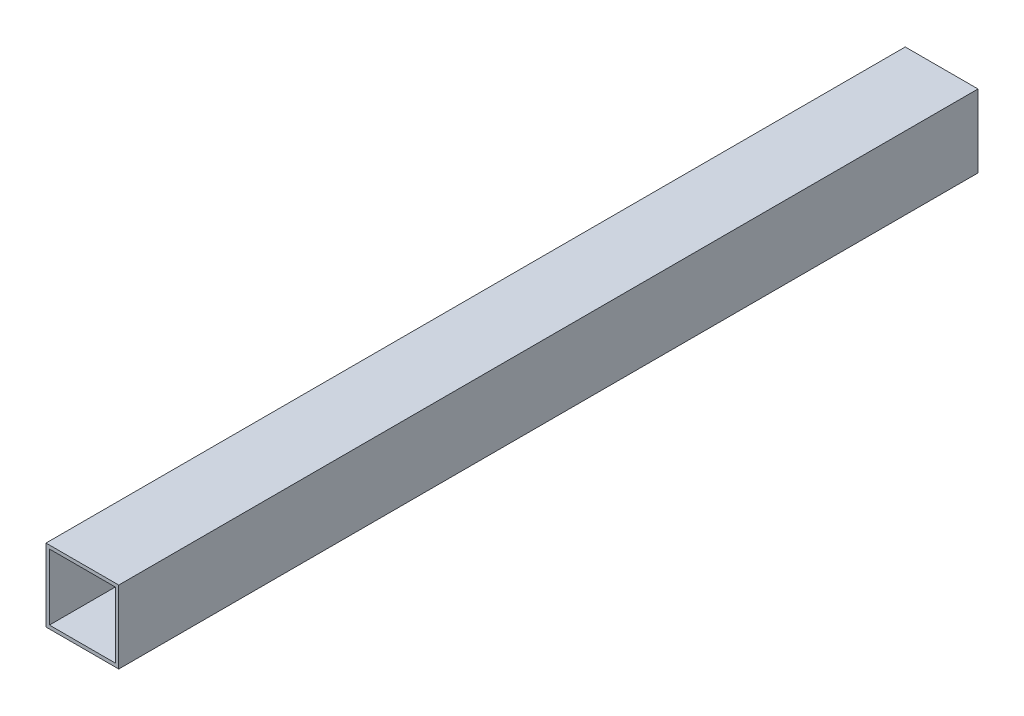
ISO-10303-21;
HEADER;
FILE_DESCRIPTION(('STEP AP214'),'2;1');
FILE_NAME('part.step','',(''),(''),'','','');
FILE_SCHEMA(('AUTOMOTIVE_DESIGN { 1 0 10303 214 1 1 1 1 }'));
ENDSEC;
DATA;
#1=APPLICATION_CONTEXT('core data for automotive mechanical design processes');
#2=APPLICATION_PROTOCOL_DEFINITION('international standard','automotive_design',2000,#1);
#3=PRODUCT_CONTEXT('',#1,'mechanical');
#4=PRODUCT('Part','Part','',(#3));
#5=PRODUCT_RELATED_PRODUCT_CATEGORY('part','',(#4));
#6=PRODUCT_DEFINITION_FORMATION('','',#4);
#7=PRODUCT_DEFINITION_CONTEXT('part definition',#1,'design');
#8=PRODUCT_DEFINITION('design','',#6,#7);
#9=PRODUCT_DEFINITION_SHAPE('','',#8);
#10=(LENGTH_UNIT() NAMED_UNIT(*) SI_UNIT(.MILLI.,.METRE.));
#11=(NAMED_UNIT(*) PLANE_ANGLE_UNIT() SI_UNIT($,.RADIAN.));
#12=(NAMED_UNIT(*) SI_UNIT($,.STERADIAN.) SOLID_ANGLE_UNIT());
#13=UNCERTAINTY_MEASURE_WITH_UNIT(LENGTH_MEASURE(1.E-05),#10,'distance_accuracy_value','');
#14=(GEOMETRIC_REPRESENTATION_CONTEXT(3) GLOBAL_UNCERTAINTY_ASSIGNED_CONTEXT((#13)) GLOBAL_UNIT_ASSIGNED_CONTEXT((#10,
#11,#12)) REPRESENTATION_CONTEXT('',''));
#15=CARTESIAN_POINT('',(0.,0.,0.));
#16=DIRECTION('',(0.,0.,1.));
#17=DIRECTION('',(1.,0.,0.));
#18=AXIS2_PLACEMENT_3D('',#15,#16,#17);
#19=CARTESIAN_POINT('',(0.,0.,150.));
#20=DIRECTION('',(0.,0.,-1.));
#21=DIRECTION('',(-1.,0.,0.));
#22=AXIS2_PLACEMENT_3D('',#19,#20,#21);
#23=PLANE('',#22);
#24=DIRECTION('',(0.,-1.,0.));
#25=VECTOR('',#24,1.);
#26=CARTESIAN_POINT('',(-12.7,12.7,150.));
#27=LINE('',#26,#25);
#28=CARTESIAN_POINT('',(-12.7,12.7,150.));
#29=VERTEX_POINT('',#28);
#30=CARTESIAN_POINT('',(-12.7,-12.7,150.));
#31=VERTEX_POINT('',#30);
#32=EDGE_CURVE('E138',#29,#31,#27,.T.);
#33=ORIENTED_EDGE('',*,*,#32,.T.);
#34=DIRECTION('',(1.,0.,0.));
#35=VECTOR('',#34,1.);
#36=CARTESIAN_POINT('',(12.7,-12.7,150.));
#37=LINE('',#36,#35);
#38=CARTESIAN_POINT('',(12.7,-12.7,150.));
#39=VERTEX_POINT('',#38);
#40=EDGE_CURVE('E141',#31,#39,#37,.T.);
#41=ORIENTED_EDGE('',*,*,#40,.T.);
#42=DIRECTION('',(0.,1.,0.));
#43=VECTOR('',#42,1.);
#44=CARTESIAN_POINT('',(12.7,12.7,150.));
#45=LINE('',#44,#43);
#46=CARTESIAN_POINT('',(12.7,12.7,150.));
#47=VERTEX_POINT('',#46);
#48=EDGE_CURVE('E144',#39,#47,#45,.T.);
#49=ORIENTED_EDGE('',*,*,#48,.T.);
#50=DIRECTION('',(-1.,0.,0.));
#51=VECTOR('',#50,1.);
#52=CARTESIAN_POINT('',(12.7,12.7,150.));
#53=LINE('',#52,#51);
#54=EDGE_CURVE('E146',#47,#29,#53,.T.);
#55=ORIENTED_EDGE('',*,*,#54,.T.);
#56=EDGE_LOOP('',(#33,#41,#49,#55));
#57=FACE_BOUND('',#56,.T.);
#58=DIRECTION('',(0.,1.,0.));
#59=VECTOR('',#58,1.);
#60=CARTESIAN_POINT('',(11.5,11.5,150.));
#61=LINE('',#60,#59);
#62=CARTESIAN_POINT('',(11.5,-11.5,150.));
#63=VERTEX_POINT('',#62);
#64=CARTESIAN_POINT('',(11.5,11.5,150.));
#65=VERTEX_POINT('',#64);
#66=EDGE_CURVE('E102',#63,#65,#61,.T.);
#67=ORIENTED_EDGE('',*,*,#66,.F.);
#68=DIRECTION('',(1.,0.,0.));
#69=VECTOR('',#68,1.);
#70=CARTESIAN_POINT('',(11.5,-11.5,150.));
#71=LINE('',#70,#69);
#72=CARTESIAN_POINT('',(-11.5,-11.5,150.));
#73=VERTEX_POINT('',#72);
#74=EDGE_CURVE('E124',#73,#63,#71,.T.);
#75=ORIENTED_EDGE('',*,*,#74,.F.);
#76=DIRECTION('',(0.,-1.,0.));
#77=VECTOR('',#76,1.);
#78=CARTESIAN_POINT('',(-11.5,11.5,150.));
#79=LINE('',#78,#77);
#80=CARTESIAN_POINT('',(-11.5,11.5,150.));
#81=VERTEX_POINT('',#80);
#82=EDGE_CURVE('E122',#81,#73,#79,.T.);
#83=ORIENTED_EDGE('',*,*,#82,.F.);
#84=DIRECTION('',(-1.,0.,0.));
#85=VECTOR('',#84,1.);
#86=CARTESIAN_POINT('',(11.5,11.5,150.));
#87=LINE('',#86,#85);
#88=EDGE_CURVE('E110',#65,#81,#87,.T.);
#89=ORIENTED_EDGE('',*,*,#88,.F.);
#90=EDGE_LOOP('',(#67,#75,#83,#89));
#91=FACE_BOUND('',#90,.T.);
#92=ADVANCED_FACE('F37',(#57,#91),#23,.F.);
#93=CARTESIAN_POINT('',(0.,0.,-150.));
#94=DIRECTION('',(0.,0.,-1.));
#95=DIRECTION('',(-1.,0.,0.));
#96=AXIS2_PLACEMENT_3D('',#93,#94,#95);
#97=PLANE('',#96);
#98=DIRECTION('',(0.,-1.,0.));
#99=VECTOR('',#98,1.);
#100=CARTESIAN_POINT('',(-12.7,12.7,-150.));
#101=LINE('',#100,#99);
#102=CARTESIAN_POINT('',(-12.7,12.7,-150.));
#103=VERTEX_POINT('',#102);
#104=CARTESIAN_POINT('',(-12.7,-12.7,-150.));
#105=VERTEX_POINT('',#104);
#106=EDGE_CURVE('E118',#103,#105,#101,.T.);
#107=ORIENTED_EDGE('',*,*,#106,.F.);
#108=DIRECTION('',(-1.,0.,0.));
#109=VECTOR('',#108,1.);
#110=CARTESIAN_POINT('',(12.7,12.7,-150.));
#111=LINE('',#110,#109);
#112=CARTESIAN_POINT('',(12.7,12.7,-150.));
#113=VERTEX_POINT('',#112);
#114=EDGE_CURVE('E142',#113,#103,#111,.T.);
#115=ORIENTED_EDGE('',*,*,#114,.F.);
#116=DIRECTION('',(0.,1.,0.));
#117=VECTOR('',#116,1.);
#118=CARTESIAN_POINT('',(12.7,12.7,-150.));
#119=LINE('',#118,#117);
#120=CARTESIAN_POINT('',(12.7,-12.7,-150.));
#121=VERTEX_POINT('',#120);
#122=EDGE_CURVE('E153',#121,#113,#119,.T.);
#123=ORIENTED_EDGE('',*,*,#122,.F.);
#124=DIRECTION('',(1.,0.,0.));
#125=VECTOR('',#124,1.);
#126=CARTESIAN_POINT('',(12.7,-12.7,-150.));
#127=LINE('',#126,#125);
#128=EDGE_CURVE('E151',#105,#121,#127,.T.);
#129=ORIENTED_EDGE('',*,*,#128,.F.);
#130=EDGE_LOOP('',(#107,#115,#123,#129));
#131=FACE_BOUND('',#130,.T.);
#132=DIRECTION('',(1.,0.,0.));
#133=VECTOR('',#132,1.);
#134=CARTESIAN_POINT('',(11.5,-11.5,-150.));
#135=LINE('',#134,#133);
#136=CARTESIAN_POINT('',(-11.5,-11.5,-150.));
#137=VERTEX_POINT('',#136);
#138=CARTESIAN_POINT('',(11.5,-11.5,-150.));
#139=VERTEX_POINT('',#138);
#140=EDGE_CURVE('E111',#137,#139,#135,.T.);
#141=ORIENTED_EDGE('',*,*,#140,.T.);
#142=DIRECTION('',(0.,1.,0.));
#143=VECTOR('',#142,1.);
#144=CARTESIAN_POINT('',(11.5,11.5,-150.));
#145=LINE('',#144,#143);
#146=CARTESIAN_POINT('',(11.5,11.5,-150.));
#147=VERTEX_POINT('',#146);
#148=EDGE_CURVE('E60',#139,#147,#145,.T.);
#149=ORIENTED_EDGE('',*,*,#148,.T.);
#150=DIRECTION('',(-1.,0.,0.));
#151=VECTOR('',#150,1.);
#152=CARTESIAN_POINT('',(11.5,11.5,-150.));
#153=LINE('',#152,#151);
#154=CARTESIAN_POINT('',(-11.5,11.5,-150.));
#155=VERTEX_POINT('',#154);
#156=EDGE_CURVE('E117',#147,#155,#153,.T.);
#157=ORIENTED_EDGE('',*,*,#156,.T.);
#158=DIRECTION('',(0.,-1.,0.));
#159=VECTOR('',#158,1.);
#160=CARTESIAN_POINT('',(-11.5,11.5,-150.));
#161=LINE('',#160,#159);
#162=EDGE_CURVE('E130',#155,#137,#161,.T.);
#163=ORIENTED_EDGE('',*,*,#162,.T.);
#164=EDGE_LOOP('',(#141,#149,#157,#163));
#165=FACE_BOUND('',#164,.T.);
#166=ADVANCED_FACE('F171',(#131,#165),#97,.T.);
#167=CARTESIAN_POINT('',(-12.7,12.7,150.));
#168=DIRECTION('',(1.,0.,0.));
#169=DIRECTION('',(0.,1.,0.));
#170=AXIS2_PLACEMENT_3D('',#167,#168,#169);
#171=PLANE('',#170);
#172=ORIENTED_EDGE('',*,*,#106,.T.);
#173=DIRECTION('',(0.,0.,-1.));
#174=VECTOR('',#173,1.);
#175=CARTESIAN_POINT('',(-12.7,-12.7,150.));
#176=LINE('',#175,#174);
#177=EDGE_CURVE('E11',#31,#105,#176,.T.);
#178=ORIENTED_EDGE('',*,*,#177,.F.);
#179=ORIENTED_EDGE('',*,*,#32,.F.);
#180=DIRECTION('',(0.,0.,-1.));
#181=VECTOR('',#180,1.);
#182=CARTESIAN_POINT('',(-12.7,12.7,150.));
#183=LINE('',#182,#181);
#184=EDGE_CURVE('E148',#29,#103,#183,.T.);
#185=ORIENTED_EDGE('',*,*,#184,.T.);
#186=EDGE_LOOP('',(#172,#178,#179,#185));
#187=FACE_BOUND('',#186,.T.);
#188=ADVANCED_FACE('F39',(#187),#171,.F.);
#189=CARTESIAN_POINT('',(12.7,-12.7,150.));
#190=DIRECTION('',(0.,1.,0.));
#191=DIRECTION('',(-1.,0.,0.));
#192=AXIS2_PLACEMENT_3D('',#189,#190,#191);
#193=PLANE('',#192);
#194=ORIENTED_EDGE('',*,*,#128,.T.);
#195=DIRECTION('',(0.,0.,-1.));
#196=VECTOR('',#195,1.);
#197=CARTESIAN_POINT('',(12.7,-12.7,150.));
#198=LINE('',#197,#196);
#199=EDGE_CURVE('E45',#39,#121,#198,.T.);
#200=ORIENTED_EDGE('',*,*,#199,.F.);
#201=ORIENTED_EDGE('',*,*,#40,.F.);
#202=ORIENTED_EDGE('',*,*,#177,.T.);
#203=EDGE_LOOP('',(#194,#200,#201,#202));
#204=FACE_BOUND('',#203,.T.);
#205=ADVANCED_FACE('F181',(#204),#193,.F.);
#206=CARTESIAN_POINT('',(12.7,12.7,150.));
#207=DIRECTION('',(-1.,0.,0.));
#208=DIRECTION('',(0.,-1.,0.));
#209=AXIS2_PLACEMENT_3D('',#206,#207,#208);
#210=PLANE('',#209);
#211=ORIENTED_EDGE('',*,*,#122,.T.);
#212=DIRECTION('',(0.,0.,-1.));
#213=VECTOR('',#212,1.);
#214=CARTESIAN_POINT('',(12.7,12.7,150.));
#215=LINE('',#214,#213);
#216=EDGE_CURVE('E158',#47,#113,#215,.T.);
#217=ORIENTED_EDGE('',*,*,#216,.F.);
#218=ORIENTED_EDGE('',*,*,#48,.F.);
#219=ORIENTED_EDGE('',*,*,#199,.T.);
#220=EDGE_LOOP('',(#211,#217,#218,#219));
#221=FACE_BOUND('',#220,.T.);
#222=ADVANCED_FACE('F165',(#221),#210,.F.);
#223=CARTESIAN_POINT('',(12.7,12.7,150.));
#224=DIRECTION('',(0.,-1.,0.));
#225=DIRECTION('',(1.,0.,0.));
#226=AXIS2_PLACEMENT_3D('',#223,#224,#225);
#227=PLANE('',#226);
#228=ORIENTED_EDGE('',*,*,#114,.T.);
#229=ORIENTED_EDGE('',*,*,#184,.F.);
#230=ORIENTED_EDGE('',*,*,#54,.F.);
#231=ORIENTED_EDGE('',*,*,#216,.T.);
#232=EDGE_LOOP('',(#228,#229,#230,#231));
#233=FACE_BOUND('',#232,.T.);
#234=ADVANCED_FACE('F175',(#233),#227,.F.);
#235=CARTESIAN_POINT('',(11.5,11.5,150.));
#236=DIRECTION('',(-1.,0.,0.));
#237=DIRECTION('',(0.,0.,1.));
#238=AXIS2_PLACEMENT_3D('',#235,#236,#237);
#239=PLANE('',#238);
#240=ORIENTED_EDGE('',*,*,#148,.F.);
#241=DIRECTION('',(0.,0.,-1.));
#242=VECTOR('',#241,1.);
#243=CARTESIAN_POINT('',(11.5,-11.5,150.));
#244=LINE('',#243,#242);
#245=EDGE_CURVE('E106',#63,#139,#244,.T.);
#246=ORIENTED_EDGE('',*,*,#245,.F.);
#247=ORIENTED_EDGE('',*,*,#66,.T.);
#248=DIRECTION('',(0.,0.,-1.));
#249=VECTOR('',#248,1.);
#250=CARTESIAN_POINT('',(11.5,11.5,150.));
#251=LINE('',#250,#249);
#252=EDGE_CURVE('E105',#65,#147,#251,.T.);
#253=ORIENTED_EDGE('',*,*,#252,.T.);
#254=EDGE_LOOP('',(#240,#246,#247,#253));
#255=FACE_BOUND('',#254,.T.);
#256=ADVANCED_FACE('F104',(#255),#239,.T.);
#257=CARTESIAN_POINT('',(11.5,11.5,150.));
#258=DIRECTION('',(0.,-1.,0.));
#259=DIRECTION('',(0.,0.,-1.));
#260=AXIS2_PLACEMENT_3D('',#257,#258,#259);
#261=PLANE('',#260);
#262=ORIENTED_EDGE('',*,*,#156,.F.);
#263=ORIENTED_EDGE('',*,*,#252,.F.);
#264=ORIENTED_EDGE('',*,*,#88,.T.);
#265=DIRECTION('',(0.,0.,-1.));
#266=VECTOR('',#265,1.);
#267=CARTESIAN_POINT('',(-11.5,11.5,150.));
#268=LINE('',#267,#266);
#269=EDGE_CURVE('E119',#81,#155,#268,.T.);
#270=ORIENTED_EDGE('',*,*,#269,.T.);
#271=EDGE_LOOP('',(#262,#263,#264,#270));
#272=FACE_BOUND('',#271,.T.);
#273=ADVANCED_FACE('F114',(#272),#261,.T.);
#274=CARTESIAN_POINT('',(-11.5,11.5,150.));
#275=DIRECTION('',(1.,0.,0.));
#276=DIRECTION('',(0.,0.,-1.));
#277=AXIS2_PLACEMENT_3D('',#274,#275,#276);
#278=PLANE('',#277);
#279=ORIENTED_EDGE('',*,*,#162,.F.);
#280=ORIENTED_EDGE('',*,*,#269,.F.);
#281=ORIENTED_EDGE('',*,*,#82,.T.);
#282=DIRECTION('',(0.,0.,-1.));
#283=VECTOR('',#282,1.);
#284=CARTESIAN_POINT('',(-11.5,-11.5,150.));
#285=LINE('',#284,#283);
#286=EDGE_CURVE('E52',#73,#137,#285,.T.);
#287=ORIENTED_EDGE('',*,*,#286,.T.);
#288=EDGE_LOOP('',(#279,#280,#281,#287));
#289=FACE_BOUND('',#288,.T.);
#290=ADVANCED_FACE('F204',(#289),#278,.T.);
#291=CARTESIAN_POINT('',(11.5,-11.5,150.));
#292=DIRECTION('',(0.,1.,0.));
#293=DIRECTION('',(0.,0.,1.));
#294=AXIS2_PLACEMENT_3D('',#291,#292,#293);
#295=PLANE('',#294);
#296=ORIENTED_EDGE('',*,*,#140,.F.);
#297=ORIENTED_EDGE('',*,*,#286,.F.);
#298=ORIENTED_EDGE('',*,*,#74,.T.);
#299=ORIENTED_EDGE('',*,*,#245,.T.);
#300=EDGE_LOOP('',(#296,#297,#298,#299));
#301=FACE_BOUND('',#300,.T.);
#302=ADVANCED_FACE('F208',(#301),#295,.T.);
#303=CLOSED_SHELL('',(#92,#166,#188,#205,#222,#234,#256,#273,#290,#302));
#304=MANIFOLD_SOLID_BREP('B2',#303);
#305=ADVANCED_BREP_SHAPE_REPRESENTATION('',(#18,#304),#14);
#306=SHAPE_DEFINITION_REPRESENTATION(#9,#305);
ENDSEC;
END-ISO-10303-21;
